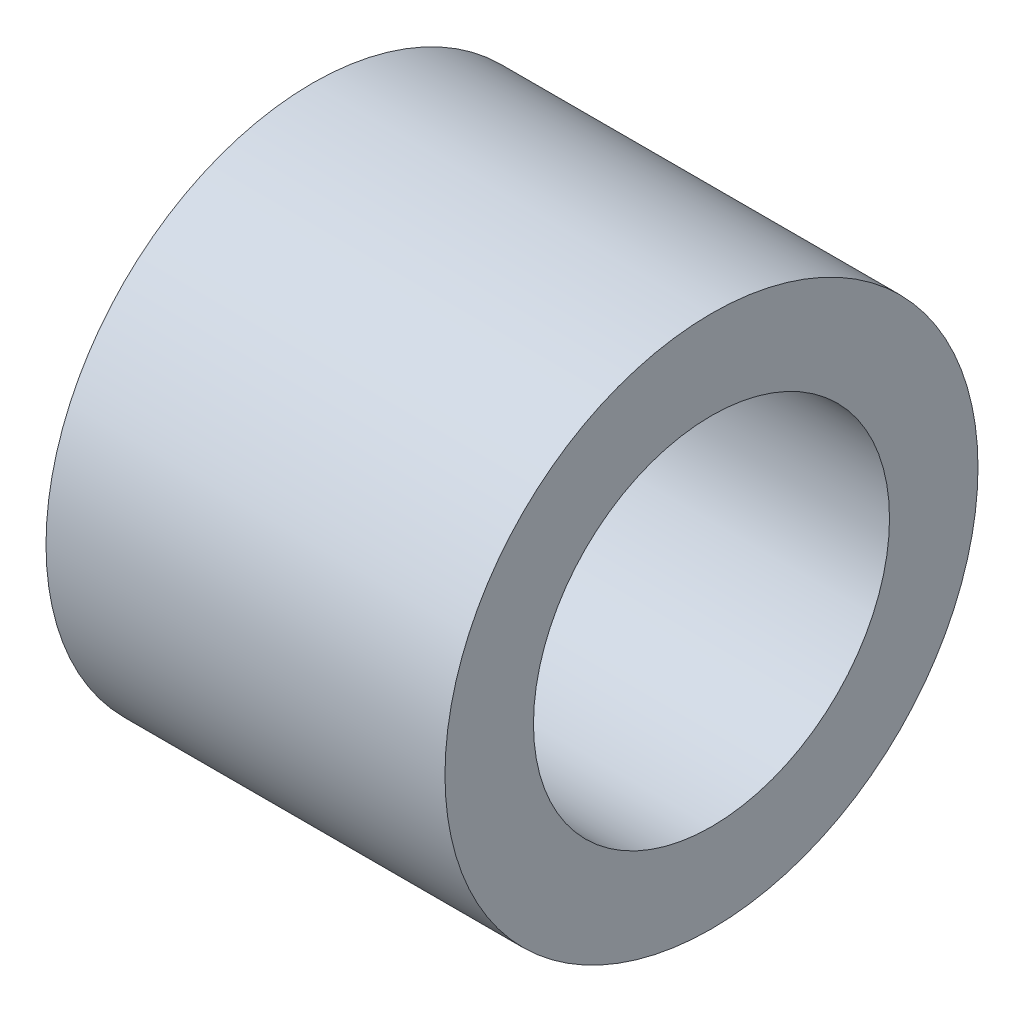
ISO-10303-21;
HEADER;
FILE_DESCRIPTION(('STEP AP214'),'2;1');
FILE_NAME('part.step','',(''),(''),'','','');
FILE_SCHEMA(('AUTOMOTIVE_DESIGN { 1 0 10303 214 1 1 1 1 }'));
ENDSEC;
DATA;
#1=APPLICATION_CONTEXT('core data for automotive mechanical design processes');
#2=APPLICATION_PROTOCOL_DEFINITION('international standard','automotive_design',2000,#1);
#3=PRODUCT_CONTEXT('',#1,'mechanical');
#4=PRODUCT('Part','Part','',(#3));
#5=PRODUCT_RELATED_PRODUCT_CATEGORY('part','',(#4));
#6=PRODUCT_DEFINITION_FORMATION('','',#4);
#7=PRODUCT_DEFINITION_CONTEXT('part definition',#1,'design');
#8=PRODUCT_DEFINITION('design','',#6,#7);
#9=PRODUCT_DEFINITION_SHAPE('','',#8);
#10=(LENGTH_UNIT() NAMED_UNIT(*) SI_UNIT(.MILLI.,.METRE.));
#11=(NAMED_UNIT(*) PLANE_ANGLE_UNIT() SI_UNIT($,.RADIAN.));
#12=(NAMED_UNIT(*) SI_UNIT($,.STERADIAN.) SOLID_ANGLE_UNIT());
#13=UNCERTAINTY_MEASURE_WITH_UNIT(LENGTH_MEASURE(1.E-05),#10,'distance_accuracy_value','');
#14=(GEOMETRIC_REPRESENTATION_CONTEXT(3) GLOBAL_UNCERTAINTY_ASSIGNED_CONTEXT((#13)) GLOBAL_UNIT_ASSIGNED_CONTEXT((#10,
#11,#12)) REPRESENTATION_CONTEXT('',''));
#15=CARTESIAN_POINT('',(0.,0.,0.));
#16=DIRECTION('',(0.,0.,1.));
#17=DIRECTION('',(1.,0.,0.));
#18=AXIS2_PLACEMENT_3D('',#15,#16,#17);
#19=CARTESIAN_POINT('',(2.38125,0.,0.));
#20=DIRECTION('',(1.,0.,0.));
#21=DIRECTION('',(0.,0.,-1.));
#22=AXIS2_PLACEMENT_3D('',#19,#20,#21);
#23=PLANE('',#22);
#24=CARTESIAN_POINT('',(2.38125,0.,0.));
#25=DIRECTION('',(1.,0.,0.));
#26=DIRECTION('',(0.,0.,-1.));
#27=AXIS2_PLACEMENT_3D('',#24,#25,#26);
#28=CIRCLE('',#27,3.18135);
#29=CARTESIAN_POINT('',(2.38125,0.,3.18135));
#30=VERTEX_POINT('',#29);
#31=EDGE_CURVE('E10',#30,#30,#28,.T.);
#32=ORIENTED_EDGE('',*,*,#31,.T.);
#33=EDGE_LOOP('',(#32));
#34=FACE_BOUND('',#33,.T.);
#35=CARTESIAN_POINT('',(2.38125,0.,0.));
#36=DIRECTION('',(1.,0.,0.));
#37=DIRECTION('',(0.,0.,-1.));
#38=AXIS2_PLACEMENT_3D('',#35,#36,#37);
#39=CIRCLE('',#38,2.124999941);
#40=CARTESIAN_POINT('',(2.38125,0.,2.124999941));
#41=VERTEX_POINT('',#40);
#42=EDGE_CURVE('E56',#41,#41,#39,.T.);
#43=ORIENTED_EDGE('',*,*,#42,.F.);
#44=EDGE_LOOP('',(#43));
#45=FACE_BOUND('',#44,.T.);
#46=ADVANCED_FACE('F43',(#34,#45),#23,.T.);
#47=CARTESIAN_POINT('',(-2.38125,0.,0.));
#48=DIRECTION('',(1.,0.,0.));
#49=DIRECTION('',(0.,0.,-1.));
#50=AXIS2_PLACEMENT_3D('',#47,#48,#49);
#51=PLANE('',#50);
#52=CARTESIAN_POINT('',(-2.38125,0.,0.));
#53=DIRECTION('',(1.,0.,0.));
#54=DIRECTION('',(0.,0.,-1.));
#55=AXIS2_PLACEMENT_3D('',#52,#53,#54);
#56=CIRCLE('',#55,3.18135);
#57=CARTESIAN_POINT('',(-2.38125,0.,3.18135));
#58=VERTEX_POINT('',#57);
#59=EDGE_CURVE('E47',#58,#58,#56,.T.);
#60=ORIENTED_EDGE('',*,*,#59,.F.);
#61=EDGE_LOOP('',(#60));
#62=FACE_BOUND('',#61,.T.);
#63=CARTESIAN_POINT('',(-2.38125,0.,0.));
#64=DIRECTION('',(1.,0.,0.));
#65=DIRECTION('',(0.,0.,-1.));
#66=AXIS2_PLACEMENT_3D('',#63,#64,#65);
#67=CIRCLE('',#66,2.124999941);
#68=CARTESIAN_POINT('',(-2.38125,0.,2.124999941));
#69=VERTEX_POINT('',#68);
#70=EDGE_CURVE('E58',#69,#69,#67,.T.);
#71=ORIENTED_EDGE('',*,*,#70,.T.);
#72=EDGE_LOOP('',(#71));
#73=FACE_BOUND('',#72,.T.);
#74=ADVANCED_FACE('F70',(#62,#73),#51,.F.);
#75=CARTESIAN_POINT('',(2.38125,0.,0.));
#76=DIRECTION('',(-1.,0.,0.));
#77=DIRECTION('',(0.,0.,1.));
#78=AXIS2_PLACEMENT_3D('',#75,#76,#77);
#79=CYLINDRICAL_SURFACE('',#78,3.18135);
#80=CARTESIAN_POINT('',(2.38125,0.,3.18135));
#81=CARTESIAN_POINT('',(2.331640625,0.,3.18135));
#82=CARTESIAN_POINT('',(2.28203125,0.,3.18135));
#83=CARTESIAN_POINT('',(2.1828125,0.,3.18135));
#84=CARTESIAN_POINT('',(2.133203125,0.,3.18135));
#85=CARTESIAN_POINT('',(2.033984375,0.,3.18135));
#86=CARTESIAN_POINT('',(1.984375,0.,3.18135));
#87=CARTESIAN_POINT('',(1.88515625,0.,3.18135));
#88=CARTESIAN_POINT('',(1.835546875,0.,3.18135));
#89=CARTESIAN_POINT('',(1.736328125,0.,3.18135));
#90=CARTESIAN_POINT('',(1.68671875,0.,3.18135));
#91=CARTESIAN_POINT('',(1.5875,0.,3.18135));
#92=CARTESIAN_POINT('',(1.537890625,0.,3.18135));
#93=CARTESIAN_POINT('',(1.438671875,0.,3.18135));
#94=CARTESIAN_POINT('',(1.3890625,0.,3.18135));
#95=CARTESIAN_POINT('',(1.28984375,0.,3.18135));
#96=CARTESIAN_POINT('',(1.240234375,0.,3.18135));
#97=CARTESIAN_POINT('',(1.141015625,0.,3.18135));
#98=CARTESIAN_POINT('',(1.09140625,0.,3.18135));
#99=CARTESIAN_POINT('',(0.9921875,0.,3.18135));
#100=CARTESIAN_POINT('',(0.942578125,0.,3.18135));
#101=CARTESIAN_POINT('',(0.843359375,0.,3.18135));
#102=CARTESIAN_POINT('',(0.79375,0.,3.18135));
#103=CARTESIAN_POINT('',(0.69453125,0.,3.18135));
#104=CARTESIAN_POINT('',(0.644921875,0.,3.18135));
#105=CARTESIAN_POINT('',(0.545703125,0.,3.18135));
#106=CARTESIAN_POINT('',(0.49609375,0.,3.18135));
#107=CARTESIAN_POINT('',(0.396875,0.,3.18135));
#108=CARTESIAN_POINT('',(0.347265625,0.,3.18135));
#109=CARTESIAN_POINT('',(0.248046875,0.,3.18135));
#110=CARTESIAN_POINT('',(0.1984375,0.,3.18135));
#111=CARTESIAN_POINT('',(0.09921875,0.,3.18135));
#112=CARTESIAN_POINT('',(0.049609375,0.,3.18135));
#113=CARTESIAN_POINT('',(-0.049609375,0.,3.18135));
#114=CARTESIAN_POINT('',(-0.09921875,0.,3.18135));
#115=CARTESIAN_POINT('',(-0.1984375,0.,3.18135));
#116=CARTESIAN_POINT('',(-0.248046875,0.,3.18135));
#117=CARTESIAN_POINT('',(-0.347265625,0.,3.18135));
#118=CARTESIAN_POINT('',(-0.396875,0.,3.18135));
#119=CARTESIAN_POINT('',(-0.49609375,0.,3.18135));
#120=CARTESIAN_POINT('',(-0.545703125,0.,3.18135));
#121=CARTESIAN_POINT('',(-0.644921875,0.,3.18135));
#122=CARTESIAN_POINT('',(-0.69453125,0.,3.18135));
#123=CARTESIAN_POINT('',(-0.79375,0.,3.18135));
#124=CARTESIAN_POINT('',(-0.843359375,0.,3.18135));
#125=CARTESIAN_POINT('',(-0.942578125,0.,3.18135));
#126=CARTESIAN_POINT('',(-0.9921875,0.,3.18135));
#127=CARTESIAN_POINT('',(-1.09140625,0.,3.18135));
#128=CARTESIAN_POINT('',(-1.141015625,0.,3.18135));
#129=CARTESIAN_POINT('',(-1.240234375,0.,3.18135));
#130=CARTESIAN_POINT('',(-1.28984375,0.,3.18135));
#131=CARTESIAN_POINT('',(-1.3890625,0.,3.18135));
#132=CARTESIAN_POINT('',(-1.438671875,0.,3.18135));
#133=CARTESIAN_POINT('',(-1.537890625,0.,3.18135));
#134=CARTESIAN_POINT('',(-1.5875,0.,3.18135));
#135=CARTESIAN_POINT('',(-1.68671875,0.,3.18135));
#136=CARTESIAN_POINT('',(-1.736328125,0.,3.18135));
#137=CARTESIAN_POINT('',(-1.835546875,0.,3.18135));
#138=CARTESIAN_POINT('',(-1.88515625,0.,3.18135));
#139=CARTESIAN_POINT('',(-1.984375,0.,3.18135));
#140=CARTESIAN_POINT('',(-2.033984375,0.,3.18135));
#141=CARTESIAN_POINT('',(-2.133203125,0.,3.18135));
#142=CARTESIAN_POINT('',(-2.1828125,0.,3.18135));
#143=CARTESIAN_POINT('',(-2.28203125,0.,3.18135));
#144=CARTESIAN_POINT('',(-2.331640625,0.,3.18135));
#145=CARTESIAN_POINT('',(-2.38125,0.,3.18135));
#146=B_SPLINE_CURVE_WITH_KNOTS('',3,(#80,#81,#82,#83,#84,#85,#86,#87,#88,#89,#90,#91,#92,#93,
#94,#95,#96,#97,#98,#99,#100,#101,#102,#103,#104,#105,#106,#107,#108,#109,#110,#111,#112,#113,
#114,#115,#116,#117,#118,#119,#120,#121,#122,#123,#124,#125,#126,#127,#128,#129,#130,#131,#132,
#133,#134,#135,#136,#137,#138,#139,#140,#141,#142,#143,#144,#145),.UNSPECIFIED.,.F.,.F.,(4,2,2,
2,2,2,2,2,2,2,2,2,2,2,2,2,2,2,2,2,2,2,2,2,2,2,2,2,2,2,2,2,4),(0.,0.148828125,0.29765625,
0.446484375,0.5953125,0.744140625,0.89296875,1.041796875,1.190625,1.339453125,1.48828125,
1.637109375,1.7859375,1.934765625,2.08359375,2.232421875,2.38125,2.530078125,2.67890625,
2.827734375,2.9765625,3.125390625,3.27421875,3.423046875,3.571875,3.720703125,3.86953125,
4.018359375,4.1671875,4.316015625,4.46484375,4.613671875,4.7625),.UNSPECIFIED.);
#147=EDGE_CURVE('BSEAM45',#30,#58,#146,.T.);
#148=ORIENTED_EDGE('',*,*,#31,.F.);
#149=ORIENTED_EDGE('',*,*,#59,.T.);
#150=ORIENTED_EDGE('',*,*,#147,.T.);
#151=ORIENTED_EDGE('',*,*,#147,.F.);
#152=EDGE_LOOP('',(#148,#150,#149,#151));
#153=FACE_BOUND('',#152,.T.);
#154=ADVANCED_FACE('F45',(#153),#79,.T.);
#155=CARTESIAN_POINT('',(2.38125,0.,0.));
#156=DIRECTION('',(-1.,0.,0.));
#157=DIRECTION('',(0.,0.,1.));
#158=AXIS2_PLACEMENT_3D('',#155,#156,#157);
#159=CYLINDRICAL_SURFACE('',#158,2.124999941);
#160=CARTESIAN_POINT('',(2.38125,0.,2.124999941));
#161=CARTESIAN_POINT('',(2.331640625,0.,2.124999941));
#162=CARTESIAN_POINT('',(2.28203125,0.,2.124999941));
#163=CARTESIAN_POINT('',(2.1828125,0.,2.124999941));
#164=CARTESIAN_POINT('',(2.133203125,0.,2.124999941));
#165=CARTESIAN_POINT('',(2.033984375,0.,2.124999941));
#166=CARTESIAN_POINT('',(1.984375,0.,2.124999941));
#167=CARTESIAN_POINT('',(1.88515625,0.,2.124999941));
#168=CARTESIAN_POINT('',(1.835546875,0.,2.124999941));
#169=CARTESIAN_POINT('',(1.736328125,0.,2.124999941));
#170=CARTESIAN_POINT('',(1.68671875,0.,2.124999941));
#171=CARTESIAN_POINT('',(1.5875,0.,2.124999941));
#172=CARTESIAN_POINT('',(1.537890625,0.,2.124999941));
#173=CARTESIAN_POINT('',(1.438671875,0.,2.124999941));
#174=CARTESIAN_POINT('',(1.3890625,0.,2.124999941));
#175=CARTESIAN_POINT('',(1.28984375,0.,2.124999941));
#176=CARTESIAN_POINT('',(1.240234375,0.,2.124999941));
#177=CARTESIAN_POINT('',(1.141015625,0.,2.124999941));
#178=CARTESIAN_POINT('',(1.09140625,0.,2.124999941));
#179=CARTESIAN_POINT('',(0.9921875,0.,2.124999941));
#180=CARTESIAN_POINT('',(0.942578125,0.,2.124999941));
#181=CARTESIAN_POINT('',(0.843359375,0.,2.124999941));
#182=CARTESIAN_POINT('',(0.79375,0.,2.124999941));
#183=CARTESIAN_POINT('',(0.69453125,0.,2.124999941));
#184=CARTESIAN_POINT('',(0.644921875,0.,2.124999941));
#185=CARTESIAN_POINT('',(0.545703125,0.,2.124999941));
#186=CARTESIAN_POINT('',(0.49609375,0.,2.124999941));
#187=CARTESIAN_POINT('',(0.396875,0.,2.124999941));
#188=CARTESIAN_POINT('',(0.347265625,0.,2.124999941));
#189=CARTESIAN_POINT('',(0.248046875,0.,2.124999941));
#190=CARTESIAN_POINT('',(0.1984375,0.,2.124999941));
#191=CARTESIAN_POINT('',(0.0992187499999996,0.,2.124999941));
#192=CARTESIAN_POINT('',(0.0496093749999996,0.,2.124999941));
#193=CARTESIAN_POINT('',(-0.0496093750000005,0.,2.124999941));
#194=CARTESIAN_POINT('',(-0.0992187500000005,0.,2.124999941));
#195=CARTESIAN_POINT('',(-0.198437500000001,0.,2.124999941));
#196=CARTESIAN_POINT('',(-0.248046875000001,0.,2.124999941));
#197=CARTESIAN_POINT('',(-0.347265625000001,0.,2.124999941));
#198=CARTESIAN_POINT('',(-0.396875000000001,0.,2.124999941));
#199=CARTESIAN_POINT('',(-0.496093750000001,0.,2.124999941));
#200=CARTESIAN_POINT('',(-0.545703125000001,0.,2.124999941));
#201=CARTESIAN_POINT('',(-0.644921875000001,0.,2.124999941));
#202=CARTESIAN_POINT('',(-0.694531250000001,0.,2.124999941));
#203=CARTESIAN_POINT('',(-0.793750000000001,0.,2.124999941));
#204=CARTESIAN_POINT('',(-0.843359375,0.,2.124999941));
#205=CARTESIAN_POINT('',(-0.942578125000001,0.,2.124999941));
#206=CARTESIAN_POINT('',(-0.992187500000001,0.,2.124999941));
#207=CARTESIAN_POINT('',(-1.09140625,0.,2.124999941));
#208=CARTESIAN_POINT('',(-1.141015625,0.,2.124999941));
#209=CARTESIAN_POINT('',(-1.240234375,0.,2.124999941));
#210=CARTESIAN_POINT('',(-1.28984375,0.,2.124999941));
#211=CARTESIAN_POINT('',(-1.3890625,0.,2.124999941));
#212=CARTESIAN_POINT('',(-1.438671875,0.,2.124999941));
#213=CARTESIAN_POINT('',(-1.537890625,0.,2.124999941));
#214=CARTESIAN_POINT('',(-1.5875,0.,2.124999941));
#215=CARTESIAN_POINT('',(-1.68671875,0.,2.124999941));
#216=CARTESIAN_POINT('',(-1.736328125,0.,2.124999941));
#217=CARTESIAN_POINT('',(-1.835546875,0.,2.124999941));
#218=CARTESIAN_POINT('',(-1.88515625,0.,2.124999941));
#219=CARTESIAN_POINT('',(-1.984375,0.,2.124999941));
#220=CARTESIAN_POINT('',(-2.033984375,0.,2.124999941));
#221=CARTESIAN_POINT('',(-2.133203125,0.,2.124999941));
#222=CARTESIAN_POINT('',(-2.1828125,0.,2.124999941));
#223=CARTESIAN_POINT('',(-2.28203125,0.,2.124999941));
#224=CARTESIAN_POINT('',(-2.331640625,0.,2.124999941));
#225=CARTESIAN_POINT('',(-2.38125,0.,2.124999941));
#226=B_SPLINE_CURVE_WITH_KNOTS('',3,(#160,#161,#162,#163,#164,#165,#166,#167,#168,#169,#170,
#171,#172,#173,#174,#175,#176,#177,#178,#179,#180,#181,#182,#183,#184,#185,#186,#187,#188,#189,
#190,#191,#192,#193,#194,#195,#196,#197,#198,#199,#200,#201,#202,#203,#204,#205,#206,#207,#208,
#209,#210,#211,#212,#213,#214,#215,#216,#217,#218,#219,#220,#221,#222,#223,#224,#225),
.UNSPECIFIED.,.F.,.F.,(4,2,2,2,2,2,2,2,2,2,2,2,2,2,2,2,2,2,2,2,2,2,2,2,2,2,2,2,2,2,2,2,4),(0.,
0.148828125,0.29765625,0.446484375,0.5953125,0.744140625,0.89296875,1.041796875,1.190625,
1.339453125,1.48828125,1.637109375,1.7859375,1.934765625,2.08359375,2.232421875,2.38125,
2.530078125,2.67890625,2.827734375,2.9765625,3.125390625,3.27421875,3.423046875,3.571875,
3.720703125,3.86953125,4.018359375,4.1671875,4.316015625,4.46484375,4.613671875,4.7625),.UNSPECIFIED.);
#227=EDGE_CURVE('BSEAM66',#41,#69,#226,.T.);
#228=ORIENTED_EDGE('',*,*,#42,.T.);
#229=ORIENTED_EDGE('',*,*,#70,.F.);
#230=ORIENTED_EDGE('',*,*,#227,.T.);
#231=ORIENTED_EDGE('',*,*,#227,.F.);
#232=EDGE_LOOP('',(#228,#230,#229,#231));
#233=FACE_BOUND('',#232,.T.);
#234=ADVANCED_FACE('F66',(#233),#159,.F.);
#235=CLOSED_SHELL('',(#46,#74,#154,#234));
#236=MANIFOLD_SOLID_BREP('B2',#235);
#237=ADVANCED_BREP_SHAPE_REPRESENTATION('',(#18,#236),#14);
#238=SHAPE_DEFINITION_REPRESENTATION(#9,#237);
ENDSEC;
END-ISO-10303-21;
